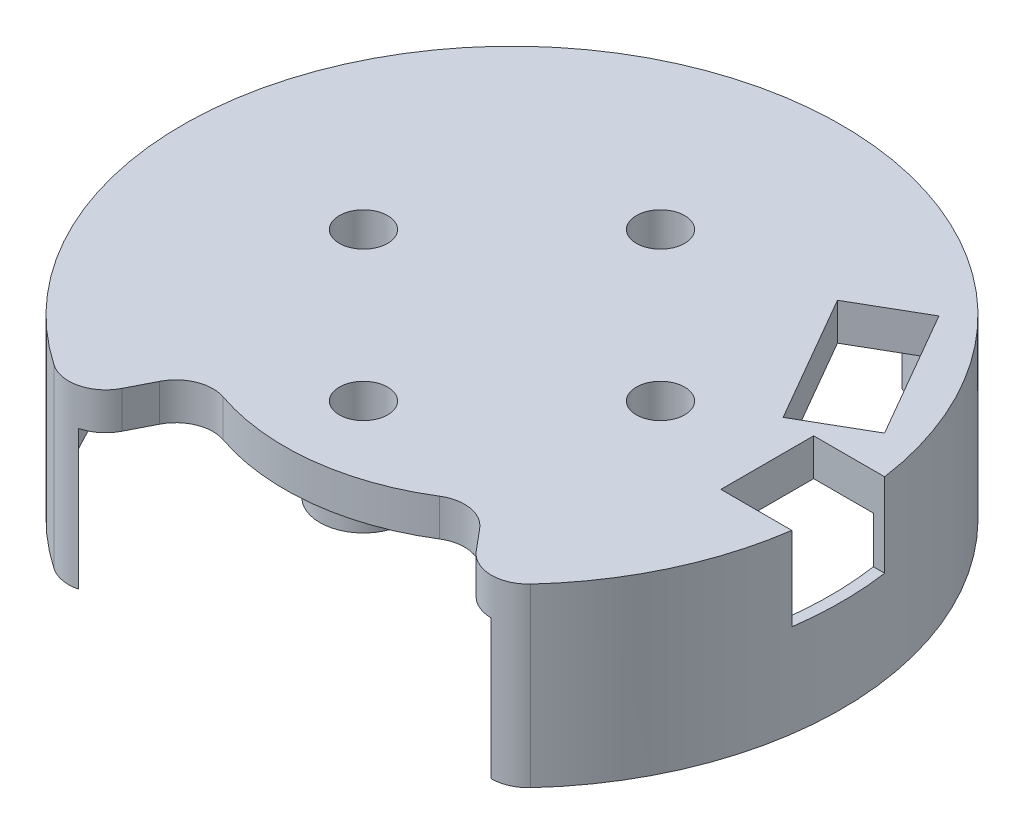
ISO-10303-21;
HEADER;
FILE_DESCRIPTION(('STEP AP214'),'2;1');
FILE_NAME('part.step','',(''),(''),'','','');
FILE_SCHEMA(('AUTOMOTIVE_DESIGN { 1 0 10303 214 1 1 1 1 }'));
ENDSEC;
DATA;
#1=APPLICATION_CONTEXT('core data for automotive mechanical design processes');
#2=APPLICATION_PROTOCOL_DEFINITION('international standard','automotive_design',2000,#1);
#3=PRODUCT_CONTEXT('',#1,'mechanical');
#4=PRODUCT('Part','Part','',(#3));
#5=PRODUCT_RELATED_PRODUCT_CATEGORY('part','',(#4));
#6=PRODUCT_DEFINITION_FORMATION('','',#4);
#7=PRODUCT_DEFINITION_CONTEXT('part definition',#1,'design');
#8=PRODUCT_DEFINITION('design','',#6,#7);
#9=PRODUCT_DEFINITION_SHAPE('','',#8);
#10=(LENGTH_UNIT() NAMED_UNIT(*) SI_UNIT(.MILLI.,.METRE.));
#11=(NAMED_UNIT(*) PLANE_ANGLE_UNIT() SI_UNIT($,.RADIAN.));
#12=(NAMED_UNIT(*) SI_UNIT($,.STERADIAN.) SOLID_ANGLE_UNIT());
#13=UNCERTAINTY_MEASURE_WITH_UNIT(LENGTH_MEASURE(1.E-05),#10,'distance_accuracy_value','');
#14=(GEOMETRIC_REPRESENTATION_CONTEXT(3) GLOBAL_UNCERTAINTY_ASSIGNED_CONTEXT((#13)) GLOBAL_UNIT_ASSIGNED_CONTEXT((#10,
#11,#12)) REPRESENTATION_CONTEXT('',''));
#15=CARTESIAN_POINT('',(0.,0.,0.));
#16=DIRECTION('',(0.,0.,1.));
#17=DIRECTION('',(1.,0.,0.));
#18=AXIS2_PLACEMENT_3D('',#15,#16,#17);
#19=CARTESIAN_POINT('',(0.,4.5,0.));
#20=DIRECTION('',(0.,-1.,0.));
#21=DIRECTION('',(0.,0.,-1.));
#22=AXIS2_PLACEMENT_3D('',#19,#20,#21);
#23=CYLINDRICAL_SURFACE('',#22,17.75);
#24=CARTESIAN_POINT('',(0.,-5.,0.));
#25=DIRECTION('',(0.,-1.,0.));
#26=DIRECTION('',(0.,0.,-1.));
#27=AXIS2_PLACEMENT_3D('',#24,#25,#26);
#28=CIRCLE('',#27,17.75);
#29=CARTESIAN_POINT('',(-10.0013975765381,-5.,14.6640562777158));
#30=VERTEX_POINT('',#29);
#31=CARTESIAN_POINT('',(-4.59403805056964,-5.,-17.145183416631));
#32=VERTEX_POINT('',#31);
#33=EDGE_CURVE('E289',#30,#32,#28,.T.);
#34=ORIENTED_EDGE('',*,*,#33,.F.);
#35=DIRECTION('',(0.,-1.,0.));
#36=VECTOR('',#35,1.);
#37=CARTESIAN_POINT('',(-10.0013975765381,4.5,14.6640562777158));
#38=LINE('',#37,#36);
#39=CARTESIAN_POINT('',(-10.0013975765381,4.5,14.6640562777158));
#40=VERTEX_POINT('',#39);
#41=EDGE_CURVE('E385',#30,#40,#38,.F.);
#42=ORIENTED_EDGE('',*,*,#41,.T.);
#43=CARTESIAN_POINT('',(0.,4.5,0.));
#44=DIRECTION('',(0.,1.,0.));
#45=DIRECTION('',(0.,0.,1.));
#46=AXIS2_PLACEMENT_3D('',#43,#44,#45);
#47=CIRCLE('',#46,17.75);
#48=CARTESIAN_POINT('',(17.57306177079,4.5,-2.5));
#49=VERTEX_POINT('',#48);
#50=EDGE_CURVE('E342',#49,#40,#47,.T.);
#51=ORIENTED_EDGE('',*,*,#50,.F.);
#52=DIRECTION('',(0.,-1.,0.));
#53=VECTOR('',#52,1.);
#54=CARTESIAN_POINT('',(17.57306177079,4.5,-2.5));
#55=LINE('',#54,#53);
#56=CARTESIAN_POINT('',(17.57306177079,0.,-2.5));
#57=VERTEX_POINT('',#56);
#58=EDGE_CURVE('E270',#49,#57,#55,.T.);
#59=ORIENTED_EDGE('',*,*,#58,.T.);
#60=CARTESIAN_POINT('',(0.,0.,0.));
#61=DIRECTION('',(0.,1.,0.));
#62=DIRECTION('',(0.,0.,1.));
#63=AXIS2_PLACEMENT_3D('',#60,#61,#62);
#64=CIRCLE('',#63,17.75);
#65=CARTESIAN_POINT('',(17.57306177079,0.,2.5));
#66=VERTEX_POINT('',#65);
#67=EDGE_CURVE('E264',#66,#57,#64,.T.);
#68=ORIENTED_EDGE('',*,*,#67,.F.);
#69=DIRECTION('',(0.,-1.,0.));
#70=VECTOR('',#69,1.);
#71=CARTESIAN_POINT('',(17.57306177079,4.5,2.5));
#72=LINE('',#71,#70);
#73=CARTESIAN_POINT('',(17.57306177079,4.5,2.5));
#74=VERTEX_POINT('',#73);
#75=EDGE_CURVE('E276',#66,#74,#72,.F.);
#76=ORIENTED_EDGE('',*,*,#75,.T.);
#77=CARTESIAN_POINT('',(13.0437573252243,4.5,12.0383925355779));
#78=VERTEX_POINT('',#77);
#79=EDGE_CURVE('E341',#78,#74,#47,.T.);
#80=ORIENTED_EDGE('',*,*,#79,.F.);
#81=DIRECTION('',(0.,-1.,0.));
#82=VECTOR('',#81,1.);
#83=CARTESIAN_POINT('',(13.0437573252243,4.5,12.0383925355779));
#84=LINE('',#83,#82);
#85=CARTESIAN_POINT('',(13.0437573252243,-5.,12.0383925355779));
#86=VERTEX_POINT('',#85);
#87=EDGE_CURVE('E383',#78,#86,#84,.T.);
#88=ORIENTED_EDGE('',*,*,#87,.T.);
#89=CARTESIAN_POINT('',(4.59403805056963,-5.,-17.145183416631));
#90=VERTEX_POINT('',#89);
#91=EDGE_CURVE('E284',#90,#86,#28,.T.);
#92=ORIENTED_EDGE('',*,*,#91,.F.);
#93=DIRECTION('',(0.,-1.,0.));
#94=VECTOR('',#93,1.);
#95=CARTESIAN_POINT('',(4.59403805056963,-1.5,-17.145183416631));
#96=LINE('',#95,#94);
#97=CARTESIAN_POINT('',(4.59403805056963,-1.5,-17.145183416631));
#98=VERTEX_POINT('',#97);
#99=EDGE_CURVE('E229',#98,#90,#96,.T.);
#100=ORIENTED_EDGE('',*,*,#99,.F.);
#101=CARTESIAN_POINT('',(0.,-1.5,0.));
#102=DIRECTION('',(0.,-1.,0.));
#103=DIRECTION('',(0.,0.,-1.));
#104=AXIS2_PLACEMENT_3D('',#101,#102,#103);
#105=CIRCLE('',#104,17.75);
#106=CARTESIAN_POINT('',(-4.59403805056964,-1.5,-17.145183416631));
#107=VERTEX_POINT('',#106);
#108=EDGE_CURVE('E860',#107,#98,#105,.T.);
#109=ORIENTED_EDGE('',*,*,#108,.F.);
#110=DIRECTION('',(0.,-1.,0.));
#111=VECTOR('',#110,1.);
#112=CARTESIAN_POINT('',(-4.59403805056964,-1.5,-17.145183416631));
#113=LINE('',#112,#111);
#114=EDGE_CURVE('E218',#107,#32,#113,.T.);
#115=ORIENTED_EDGE('',*,*,#114,.T.);
#116=EDGE_LOOP('',(#34,#42,#51,#59,#68,#76,#80,#88,#92,#100,#109,#115));
#117=FACE_BOUND('',#116,.T.);
#118=ADVANCED_FACE('F37',(#117),#23,.T.);
#119=CARTESIAN_POINT('',(0.,-5.,0.));
#120=DIRECTION('',(0.,-1.,0.));
#121=DIRECTION('',(0.,0.,-1.));
#122=AXIS2_PLACEMENT_3D('',#119,#120,#121);
#123=PLANE('',#122);
#124=CARTESIAN_POINT('',(0.,-5.,0.));
#125=DIRECTION('',(0.,-1.,0.));
#126=DIRECTION('',(0.,0.,-1.));
#127=AXIS2_PLACEMENT_3D('',#124,#125,#126);
#128=CIRCLE('',#127,17.15);
#129=CARTESIAN_POINT('',(-8.39669798990904,-5.,14.9538611357153));
#130=VERTEX_POINT('',#129);
#131=CARTESIAN_POINT('',(-4.43874662350813,-5.,-16.5656279208575));
#132=VERTEX_POINT('',#131);
#133=EDGE_CURVE('E222',#130,#132,#128,.T.);
#134=ORIENTED_EDGE('',*,*,#133,.F.);
#135=CARTESIAN_POINT('',(-8.87447953974509,-5.,13.0117682464239));
#136=DIRECTION('',(0.,-1.,0.));
#137=DIRECTION('',(0.,0.,-1.));
#138=AXIS2_PLACEMENT_3D('',#135,#136,#137);
#139=CIRCLE('',#138,2.);
#140=EDGE_CURVE('E404',#130,#30,#139,.T.);
#141=ORIENTED_EDGE('',*,*,#140,.T.);
#142=ORIENTED_EDGE('',*,*,#33,.T.);
#143=DIRECTION('',(0.258819045102517,0.,0.965925826289069));
#144=VECTOR('',#143,1.);
#145=CARTESIAN_POINT('',(-4.59403805056963,-5.,-17.145183416631));
#146=LINE('',#145,#144);
#147=EDGE_CURVE('E858',#32,#132,#146,.T.);
#148=ORIENTED_EDGE('',*,*,#147,.T.);
#149=EDGE_LOOP('',(#134,#141,#142,#148));
#150=FACE_BOUND('',#149,.T.);
#151=ADVANCED_FACE('F492',(#150),#123,.T.);
#152=ORIENTED_EDGE('',*,*,#91,.T.);
#153=CARTESIAN_POINT('',(11.5740381899878,-5.,10.6819539400198));
#154=DIRECTION('',(0.,-1.,0.));
#155=DIRECTION('',(0.,0.,-1.));
#156=AXIS2_PLACEMENT_3D('',#153,#154,#155);
#157=CIRCLE('',#156,2.);
#158=CARTESIAN_POINT('',(11.5453779934007,-5.,12.6817485777593));
#159=VERTEX_POINT('',#158);
#160=EDGE_CURVE('E52',#86,#159,#157,.T.);
#161=ORIENTED_EDGE('',*,*,#160,.T.);
#162=CARTESIAN_POINT('',(4.43874662350812,-5.,-16.5656279208575));
#163=VERTEX_POINT('',#162);
#164=EDGE_CURVE('E285',#163,#159,#128,.T.);
#165=ORIENTED_EDGE('',*,*,#164,.F.);
#166=DIRECTION('',(0.258819045102517,0.,-0.965925826289069));
#167=VECTOR('',#166,1.);
#168=CARTESIAN_POINT('',(4.43874662350812,-5.,-16.5656279208575));
#169=LINE('',#168,#167);
#170=EDGE_CURVE('E219',#163,#90,#169,.T.);
#171=ORIENTED_EDGE('',*,*,#170,.T.);
#172=EDGE_LOOP('',(#152,#161,#165,#171));
#173=FACE_BOUND('',#172,.T.);
#174=ADVANCED_FACE('F497',(#173),#123,.T.);
#175=CARTESIAN_POINT('',(0.,-5.,0.));
#176=DIRECTION('',(0.,1.,0.));
#177=DIRECTION('',(0.,0.,1.));
#178=AXIS2_PLACEMENT_3D('',#175,#176,#177);
#179=CYLINDRICAL_SURFACE('',#178,17.15);
#180=CARTESIAN_POINT('',(0.,2.5,0.));
#181=DIRECTION('',(0.,-1.,0.));
#182=DIRECTION('',(0.,0.,-1.));
#183=AXIS2_PLACEMENT_3D('',#180,#181,#182);
#184=CIRCLE('',#183,17.15);
#185=CARTESIAN_POINT('',(-8.39669798990904,2.5,14.9538611357153));
#186=VERTEX_POINT('',#185);
#187=CARTESIAN_POINT('',(16.966805827851,2.5,-2.5));
#188=VERTEX_POINT('',#187);
#189=EDGE_CURVE('E282',#186,#188,#184,.T.);
#190=ORIENTED_EDGE('',*,*,#189,.F.);
#191=DIRECTION('',(0.,-1.,0.));
#192=VECTOR('',#191,1.);
#193=CARTESIAN_POINT('',(-8.39669798990904,2.5,14.9538611357153));
#194=LINE('',#193,#192);
#195=EDGE_CURVE('E60',#186,#130,#194,.T.);
#196=ORIENTED_EDGE('',*,*,#195,.T.);
#197=ORIENTED_EDGE('',*,*,#133,.T.);
#198=DIRECTION('',(0.,-1.,0.));
#199=VECTOR('',#198,1.);
#200=CARTESIAN_POINT('',(-4.43874662350813,-1.5,-16.5656279208575));
#201=LINE('',#200,#199);
#202=CARTESIAN_POINT('',(-4.43874662350813,-1.5,-16.5656279208575));
#203=VERTEX_POINT('',#202);
#204=EDGE_CURVE('E215',#203,#132,#201,.T.);
#205=ORIENTED_EDGE('',*,*,#204,.F.);
#206=CARTESIAN_POINT('',(0.,-1.5,0.));
#207=DIRECTION('',(0.,-1.,0.));
#208=DIRECTION('',(0.,0.,-1.));
#209=AXIS2_PLACEMENT_3D('',#206,#207,#208);
#210=CIRCLE('',#209,17.15);
#211=CARTESIAN_POINT('',(4.43874662350812,-1.5,-16.5656279208575));
#212=VERTEX_POINT('',#211);
#213=EDGE_CURVE('E200',#203,#212,#210,.T.);
#214=ORIENTED_EDGE('',*,*,#213,.T.);
#215=DIRECTION('',(0.,-1.,0.));
#216=VECTOR('',#215,1.);
#217=CARTESIAN_POINT('',(4.43874662350812,-1.5,-16.5656279208575));
#218=LINE('',#217,#216);
#219=EDGE_CURVE('E224',#212,#163,#218,.T.);
#220=ORIENTED_EDGE('',*,*,#219,.T.);
#221=ORIENTED_EDGE('',*,*,#164,.T.);
#222=DIRECTION('',(0.,-1.,0.));
#223=VECTOR('',#222,1.);
#224=CARTESIAN_POINT('',(11.5453779934007,-5.,12.6817485777593));
#225=LINE('',#224,#223);
#226=CARTESIAN_POINT('',(11.5453779934006,2.5,12.6817485777593));
#227=VERTEX_POINT('',#226);
#228=EDGE_CURVE('E401',#159,#227,#225,.F.);
#229=ORIENTED_EDGE('',*,*,#228,.T.);
#230=CARTESIAN_POINT('',(16.966805827851,2.5,2.5));
#231=VERTEX_POINT('',#230);
#232=EDGE_CURVE('E286',#231,#227,#184,.T.);
#233=ORIENTED_EDGE('',*,*,#232,.F.);
#234=DIRECTION('',(0.,1.,0.));
#235=VECTOR('',#234,1.);
#236=CARTESIAN_POINT('',(16.966805827851,-5.,2.5));
#237=LINE('',#236,#235);
#238=CARTESIAN_POINT('',(16.966805827851,0.,2.5));
#239=VERTEX_POINT('',#238);
#240=EDGE_CURVE('E381',#239,#231,#237,.T.);
#241=ORIENTED_EDGE('',*,*,#240,.F.);
#242=CARTESIAN_POINT('',(0.,0.,0.));
#243=DIRECTION('',(0.,1.,0.));
#244=DIRECTION('',(0.,0.,1.));
#245=AXIS2_PLACEMENT_3D('',#242,#243,#244);
#246=CIRCLE('',#245,17.15);
#247=CARTESIAN_POINT('',(16.966805827851,0.,-2.5));
#248=VERTEX_POINT('',#247);
#249=EDGE_CURVE('E375',#239,#248,#246,.T.);
#250=ORIENTED_EDGE('',*,*,#249,.T.);
#251=DIRECTION('',(0.,1.,0.));
#252=VECTOR('',#251,1.);
#253=CARTESIAN_POINT('',(16.966805827851,-5.,-2.5));
#254=LINE('',#253,#252);
#255=EDGE_CURVE('E378',#188,#248,#254,.F.);
#256=ORIENTED_EDGE('',*,*,#255,.F.);
#257=EDGE_LOOP('',(#190,#196,#197,#205,#214,#220,#221,#229,#233,#241,#250,#256));
#258=FACE_BOUND('',#257,.T.);
#259=ADVANCED_FACE('F221',(#258),#179,.F.);
#260=CARTESIAN_POINT('',(0.,2.5,0.));
#261=DIRECTION('',(0.,1.,0.));
#262=DIRECTION('',(0.,0.,1.));
#263=AXIS2_PLACEMENT_3D('',#260,#261,#262);
#264=PLANE('',#263);
#265=CARTESIAN_POINT('',(0.,2.5,-8.));
#266=DIRECTION('',(0.,1.,0.));
#267=DIRECTION('',(0.,0.,1.));
#268=AXIS2_PLACEMENT_3D('',#265,#266,#267);
#269=CIRCLE('',#268,2.35);
#270=CARTESIAN_POINT('',(0.,2.5,-5.65));
#271=VERTEX_POINT('',#270);
#272=EDGE_CURVE('E349',#271,#271,#269,.T.);
#273=ORIENTED_EDGE('',*,*,#272,.T.);
#274=EDGE_LOOP('',(#273));
#275=FACE_BOUND('',#274,.T.);
#276=CARTESIAN_POINT('',(8.,2.5,0.));
#277=DIRECTION('',(0.,1.,0.));
#278=DIRECTION('',(0.,0.,1.));
#279=AXIS2_PLACEMENT_3D('',#276,#277,#278);
#280=CIRCLE('',#279,2.35);
#281=CARTESIAN_POINT('',(8.,2.5,2.35));
#282=VERTEX_POINT('',#281);
#283=EDGE_CURVE('E352',#282,#282,#280,.F.);
#284=ORIENTED_EDGE('',*,*,#283,.F.);
#285=EDGE_LOOP('',(#284));
#286=FACE_BOUND('',#285,.T.);
#287=CARTESIAN_POINT('',(0.,2.5,8.));
#288=DIRECTION('',(0.,1.,0.));
#289=DIRECTION('',(0.,0.,1.));
#290=AXIS2_PLACEMENT_3D('',#287,#288,#289);
#291=CIRCLE('',#290,2.35);
#292=CARTESIAN_POINT('',(0.,2.5,10.35));
#293=VERTEX_POINT('',#292);
#294=EDGE_CURVE('E357',#293,#293,#291,.F.);
#295=ORIENTED_EDGE('',*,*,#294,.F.);
#296=EDGE_LOOP('',(#295));
#297=FACE_BOUND('',#296,.T.);
#298=CARTESIAN_POINT('',(-8.,2.5,0.));
#299=DIRECTION('',(0.,1.,0.));
#300=DIRECTION('',(0.,0.,1.));
#301=AXIS2_PLACEMENT_3D('',#298,#299,#300);
#302=CIRCLE('',#301,2.35);
#303=CARTESIAN_POINT('',(-8.,2.5,2.35));
#304=VERTEX_POINT('',#303);
#305=EDGE_CURVE('E360',#304,#304,#302,.F.);
#306=ORIENTED_EDGE('',*,*,#305,.F.);
#307=EDGE_LOOP('',(#306));
#308=FACE_BOUND('',#307,.T.);
#309=DIRECTION('',(-0.500000051434071,0.,-0.866025374088962));
#310=VECTOR('',#309,1.);
#311=CARTESIAN_POINT('',(13.6131392623697,2.5,-7.85955069564142));
#312=LINE('',#311,#310);
#313=CARTESIAN_POINT('',(15.5320509539142,2.5,-4.53589860651229));
#314=VERTEX_POINT('',#313);
#315=CARTESIAN_POINT('',(11.5320505424416,2.5,-11.464101599224));
#316=VERTEX_POINT('',#315);
#317=EDGE_CURVE('E369',#314,#316,#312,.T.);
#318=ORIENTED_EDGE('',*,*,#317,.T.);
#319=DIRECTION('',(-0.866025374088962,0.,0.500000051434071));
#320=VECTOR('',#319,1.);
#321=CARTESIAN_POINT('',(-2.08108871992805,2.5,-3.60455090358257));
#322=LINE('',#321,#320);
#323=CARTESIAN_POINT('',(8.0679490460858,2.5,-9.4641013934877));
#324=VERTEX_POINT('',#323);
#325=EDGE_CURVE('E372',#316,#324,#322,.T.);
#326=ORIENTED_EDGE('',*,*,#325,.T.);
#327=DIRECTION('',(0.500000051434071,0.,0.866025374088962));
#328=VECTOR('',#327,1.);
#329=CARTESIAN_POINT('',(10.1490377660138,2.5,-5.85955048990513));
#330=LINE('',#329,#328);
#331=CARTESIAN_POINT('',(12.0679494575584,2.5,-2.53589840077601));
#332=VERTEX_POINT('',#331);
#333=EDGE_CURVE('E363',#324,#332,#330,.T.);
#334=ORIENTED_EDGE('',*,*,#333,.T.);
#335=DIRECTION('',(0.866025374088962,0.,-0.500000051434071));
#336=VECTOR('',#335,1.);
#337=CARTESIAN_POINT('',(1.91891169154451,2.5,3.32365208912912));
#338=LINE('',#337,#336);
#339=EDGE_CURVE('E366',#332,#314,#338,.T.);
#340=ORIENTED_EDGE('',*,*,#339,.T.);
#341=EDGE_LOOP('',(#318,#326,#334,#340));
#342=FACE_BOUND('',#341,.T.);
#343=DIRECTION('',(-0.453990499739541,0.,0.891006524188371));
#344=VECTOR('',#343,1.);
#345=CARTESIAN_POINT('',(0.,2.5,0.));
#346=LINE('',#345,#344);
#347=CARTESIAN_POINT('',(-6.40532974231333,2.5,12.571167443489));
#348=VERTEX_POINT('',#347);
#349=CARTESIAN_POINT('',(-7.09246649136834,2.5,13.919749245903));
#350=VERTEX_POINT('',#349);
#351=EDGE_CURVE('E241',#348,#350,#346,.T.);
#352=ORIENTED_EDGE('',*,*,#351,.T.);
#353=CARTESIAN_POINT('',(-8.87447953974509,2.5,13.0117682464239));
#354=DIRECTION('',(0.,1.,0.));
#355=DIRECTION('',(0.,0.,1.));
#356=AXIS2_PLACEMENT_3D('',#353,#354,#355);
#357=CIRCLE('',#356,2.);
#358=EDGE_CURVE('E399',#350,#186,#357,.F.);
#359=ORIENTED_EDGE('',*,*,#358,.T.);
#360=ORIENTED_EDGE('',*,*,#189,.T.);
#361=DIRECTION('',(-1.,0.,0.));
#362=VECTOR('',#361,1.);
#363=CARTESIAN_POINT('',(0.,2.5,-2.5));
#364=LINE('',#363,#362);
#365=CARTESIAN_POINT('',(13.75,2.5,-2.5));
#366=VERTEX_POINT('',#365);
#367=EDGE_CURVE('E267',#188,#366,#364,.T.);
#368=ORIENTED_EDGE('',*,*,#367,.T.);
#369=DIRECTION('',(0.,0.,1.));
#370=VECTOR('',#369,1.);
#371=CARTESIAN_POINT('',(13.75,2.5,0.));
#372=LINE('',#371,#370);
#373=CARTESIAN_POINT('',(13.75,2.5,2.5));
#374=VERTEX_POINT('',#373);
#375=EDGE_CURVE('E279',#366,#374,#372,.T.);
#376=ORIENTED_EDGE('',*,*,#375,.T.);
#377=DIRECTION('',(1.,0.,0.));
#378=VECTOR('',#377,1.);
#379=CARTESIAN_POINT('',(0.,2.5,2.5));
#380=LINE('',#379,#378);
#381=EDGE_CURVE('E273',#374,#231,#380,.T.);
#382=ORIENTED_EDGE('',*,*,#381,.T.);
#383=ORIENTED_EDGE('',*,*,#232,.T.);
#384=CARTESIAN_POINT('',(11.5740381899878,2.5,10.6819539400198));
#385=DIRECTION('',(0.,1.,0.));
#386=DIRECTION('',(0.,0.,1.));
#387=AXIS2_PLACEMENT_3D('',#384,#385,#386);
#388=CIRCLE('',#387,2.);
#389=CARTESIAN_POINT('',(10.0419493037498,2.5,11.9675291593929));
#390=VERTEX_POINT('',#389);
#391=EDGE_CURVE('E397',#227,#390,#388,.F.);
#392=ORIENTED_EDGE('',*,*,#391,.T.);
#393=DIRECTION('',(-0.642787609686536,0.,-0.766044443118981));
#394=VECTOR('',#393,1.);
#395=CARTESIAN_POINT('',(0.,2.5,0.));
#396=LINE('',#395,#394);
#397=CARTESIAN_POINT('',(9.06905892673476,2.5,10.8080835573848));
#398=VERTEX_POINT('',#397);
#399=EDGE_CURVE('E238',#390,#398,#396,.T.);
#400=ORIENTED_EDGE('',*,*,#399,.T.);
#401=CARTESIAN_POINT('',(7.53697004049679,2.5,12.0936587767579));
#402=DIRECTION('',(0.,1.,0.));
#403=DIRECTION('',(0.,0.,1.));
#404=AXIS2_PLACEMENT_3D('',#401,#402,#403);
#405=CIRCLE('',#404,2.);
#406=CARTESIAN_POINT('',(6.47914968393584,2.5,10.3963031589673));
#407=VERTEX_POINT('',#406);
#408=EDGE_CURVE('E11',#398,#407,#405,.T.);
#409=ORIENTED_EDGE('',*,*,#408,.T.);
#410=CARTESIAN_POINT('',(0.,2.5,0.));
#411=DIRECTION('',(0.,1.,0.));
#412=DIRECTION('',(0.,0.,1.));
#413=AXIS2_PLACEMENT_3D('',#410,#411,#412);
#414=CIRCLE('',#413,12.25);
#415=CARTESIAN_POINT('',(-3.97443014040163,2.5,11.587338135183));
#416=VERTEX_POINT('',#415);
#417=EDGE_CURVE('E244',#407,#416,#414,.F.);
#418=ORIENTED_EDGE('',*,*,#417,.T.);
#419=CARTESIAN_POINT('',(-4.62331669393659,2.5,13.479148442968));
#420=DIRECTION('',(0.,1.,0.));
#421=DIRECTION('',(0.,0.,1.));
#422=AXIS2_PLACEMENT_3D('',#419,#420,#421);
#423=CIRCLE('',#422,2.);
#424=EDGE_CURVE('E419',#416,#348,#423,.T.);
#425=ORIENTED_EDGE('',*,*,#424,.T.);
#426=EDGE_LOOP('',(#352,#359,#360,#368,#376,#382,#383,#392,#400,#409,#418,#425));
#427=FACE_BOUND('',#426,.T.);
#428=ADVANCED_FACE('F435',(#275,#286,#297,#308,#342,#427),#264,.F.);
#429=CARTESIAN_POINT('',(0.,0.,-8.));
#430=DIRECTION('',(0.,1.,0.));
#431=DIRECTION('',(0.,0.,1.));
#432=AXIS2_PLACEMENT_3D('',#429,#430,#431);
#433=PLANE('',#432);
#434=CARTESIAN_POINT('',(0.,0.,-8.));
#435=DIRECTION('',(0.,1.,0.));
#436=DIRECTION('',(0.,0.,1.));
#437=AXIS2_PLACEMENT_3D('',#434,#435,#436);
#438=CIRCLE('',#437,2.35);
#439=CARTESIAN_POINT('',(0.,0.,-5.65));
#440=VERTEX_POINT('',#439);
#441=EDGE_CURVE('E348',#440,#440,#438,.T.);
#442=ORIENTED_EDGE('',*,*,#441,.F.);
#443=EDGE_LOOP('',(#442));
#444=FACE_BOUND('',#443,.T.);
#445=CARTESIAN_POINT('',(0.,0.,-8.));
#446=DIRECTION('',(0.,1.,0.));
#447=DIRECTION('',(0.,0.,1.));
#448=AXIS2_PLACEMENT_3D('',#445,#446,#447);
#449=CIRCLE('',#448,1.3);
#450=CARTESIAN_POINT('',(0.,0.,-6.7));
#451=VERTEX_POINT('',#450);
#452=EDGE_CURVE('E345',#451,#451,#449,.T.);
#453=ORIENTED_EDGE('',*,*,#452,.T.);
#454=EDGE_LOOP('',(#453));
#455=FACE_BOUND('',#454,.T.);
#456=ADVANCED_FACE('F508',(#444,#455),#433,.F.);
#457=CARTESIAN_POINT('',(0.,2.5,-8.));
#458=DIRECTION('',(0.,-1.,0.));
#459=DIRECTION('',(0.,0.,-1.));
#460=AXIS2_PLACEMENT_3D('',#457,#458,#459);
#461=CYLINDRICAL_SURFACE('',#460,2.35);
#462=ORIENTED_EDGE('',*,*,#272,.F.);
#463=EDGE_LOOP('',(#462));
#464=FACE_BOUND('',#463,.T.);
#465=ORIENTED_EDGE('',*,*,#441,.T.);
#466=EDGE_LOOP('',(#465));
#467=FACE_BOUND('',#466,.T.);
#468=ADVANCED_FACE('F506',(#464,#467),#461,.T.);
#469=CARTESIAN_POINT('',(0.,2.5,-8.));
#470=DIRECTION('',(0.,-1.,0.));
#471=DIRECTION('',(0.,0.,-1.));
#472=AXIS2_PLACEMENT_3D('',#469,#470,#471);
#473=CYLINDRICAL_SURFACE('',#472,1.3);
#474=ORIENTED_EDGE('',*,*,#452,.F.);
#475=EDGE_LOOP('',(#474));
#476=FACE_BOUND('',#475,.T.);
#477=CARTESIAN_POINT('',(0.,4.5,-8.));
#478=DIRECTION('',(0.,-1.,0.));
#479=DIRECTION('',(0.,0.,-1.));
#480=AXIS2_PLACEMENT_3D('',#477,#478,#479);
#481=CIRCLE('',#480,1.3);
#482=CARTESIAN_POINT('',(0.,4.5,-9.3));
#483=VERTEX_POINT('',#482);
#484=EDGE_CURVE('E312',#483,#483,#481,.T.);
#485=ORIENTED_EDGE('',*,*,#484,.F.);
#486=EDGE_LOOP('',(#485));
#487=FACE_BOUND('',#486,.T.);
#488=ADVANCED_FACE('F503',(#476,#487),#473,.F.);
#489=CARTESIAN_POINT('',(0.,4.5,0.));
#490=DIRECTION('',(0.,1.,0.));
#491=DIRECTION('',(0.,0.,1.));
#492=AXIS2_PLACEMENT_3D('',#489,#490,#491);
#493=PLANE('',#492);
#494=ORIENTED_EDGE('',*,*,#50,.T.);
#495=CARTESIAN_POINT('',(-8.87447953974509,4.5,13.0117682464239));
#496=DIRECTION('',(0.,1.,0.));
#497=DIRECTION('',(0.,0.,1.));
#498=AXIS2_PLACEMENT_3D('',#495,#496,#497);
#499=CIRCLE('',#498,2.);
#500=CARTESIAN_POINT('',(-7.09246649136835,4.5,13.919749245903));
#501=VERTEX_POINT('',#500);
#502=EDGE_CURVE('E390',#40,#501,#499,.T.);
#503=ORIENTED_EDGE('',*,*,#502,.T.);
#504=DIRECTION('',(-0.453990499739541,0.,0.891006524188371));
#505=VECTOR('',#504,1.);
#506=CARTESIAN_POINT('',(-8.05833137037685,4.5,15.8153658043436));
#507=LINE('',#506,#505);
#508=CARTESIAN_POINT('',(-6.40532974231333,4.5,12.5711674434889));
#509=VERTEX_POINT('',#508);
#510=EDGE_CURVE('E235',#509,#501,#507,.T.);
#511=ORIENTED_EDGE('',*,*,#510,.F.);
#512=CARTESIAN_POINT('',(-4.62331669393659,4.5,13.479148442968));
#513=DIRECTION('',(0.,1.,0.));
#514=DIRECTION('',(0.,0.,1.));
#515=AXIS2_PLACEMENT_3D('',#512,#513,#514);
#516=CIRCLE('',#515,2.);
#517=CARTESIAN_POINT('',(-3.97443014040163,4.5,11.587338135183));
#518=VERTEX_POINT('',#517);
#519=EDGE_CURVE('E417',#509,#518,#516,.F.);
#520=ORIENTED_EDGE('',*,*,#519,.T.);
#521=CARTESIAN_POINT('',(0.,4.5,0.));
#522=DIRECTION('',(0.,-1.,0.));
#523=DIRECTION('',(0.,0.,1.));
#524=AXIS2_PLACEMENT_3D('',#521,#522,#523);
#525=CIRCLE('',#524,12.25);
#526=CARTESIAN_POINT('',(6.47914968393584,4.5,10.3963031589673));
#527=VERTEX_POINT('',#526);
#528=EDGE_CURVE('E227',#527,#518,#525,.T.);
#529=ORIENTED_EDGE('',*,*,#528,.F.);
#530=CARTESIAN_POINT('',(7.53697004049679,4.5,12.0936587767579));
#531=DIRECTION('',(0.,1.,0.));
#532=DIRECTION('',(0.,0.,1.));
#533=AXIS2_PLACEMENT_3D('',#530,#531,#532);
#534=CIRCLE('',#533,2.);
#535=CARTESIAN_POINT('',(9.06905892673475,4.5,10.8080835573848));
#536=VERTEX_POINT('',#535);
#537=EDGE_CURVE('E45',#527,#536,#534,.F.);
#538=ORIENTED_EDGE('',*,*,#537,.T.);
#539=DIRECTION('',(-0.642787609686536,0.,-0.766044443118981));
#540=VECTOR('',#539,1.);
#541=CARTESIAN_POINT('',(11.409480071936,4.5,13.5972888653619));
#542=LINE('',#541,#540);
#543=CARTESIAN_POINT('',(10.0419493037498,4.5,11.9675291593929));
#544=VERTEX_POINT('',#543);
#545=EDGE_CURVE('E223',#544,#536,#542,.T.);
#546=ORIENTED_EDGE('',*,*,#545,.F.);
#547=CARTESIAN_POINT('',(11.5740381899878,4.5,10.6819539400198));
#548=DIRECTION('',(0.,1.,0.));
#549=DIRECTION('',(0.,0.,1.));
#550=AXIS2_PLACEMENT_3D('',#547,#548,#549);
#551=CIRCLE('',#550,2.);
#552=EDGE_CURVE('E388',#544,#78,#551,.T.);
#553=ORIENTED_EDGE('',*,*,#552,.T.);
#554=ORIENTED_EDGE('',*,*,#79,.T.);
#555=DIRECTION('',(1.,0.,0.));
#556=VECTOR('',#555,1.);
#557=CARTESIAN_POINT('',(13.75,4.5,2.5));
#558=LINE('',#557,#556);
#559=CARTESIAN_POINT('',(13.75,4.5,2.5));
#560=VERTEX_POINT('',#559);
#561=EDGE_CURVE('E251',#560,#74,#558,.T.);
#562=ORIENTED_EDGE('',*,*,#561,.F.);
#563=DIRECTION('',(0.,0.,1.));
#564=VECTOR('',#563,1.);
#565=CARTESIAN_POINT('',(13.75,4.5,-2.5));
#566=LINE('',#565,#564);
#567=CARTESIAN_POINT('',(13.75,4.5,-2.5));
#568=VERTEX_POINT('',#567);
#569=EDGE_CURVE('E257',#568,#560,#566,.T.);
#570=ORIENTED_EDGE('',*,*,#569,.F.);
#571=DIRECTION('',(-1.,0.,0.));
#572=VECTOR('',#571,1.);
#573=CARTESIAN_POINT('',(13.75,4.5,-2.5));
#574=LINE('',#573,#572);
#575=EDGE_CURVE('E247',#49,#568,#574,.T.);
#576=ORIENTED_EDGE('',*,*,#575,.F.);
#577=EDGE_LOOP('',(#494,#503,#511,#520,#529,#538,#546,#553,#554,#562,#570,#576));
#578=FACE_BOUND('',#577,.T.);
#579=DIRECTION('',(-0.866025374088962,0.,0.500000051434071));
#580=VECTOR('',#579,1.);
#581=CARTESIAN_POINT('',(-2.08108871992805,4.5,-3.60455090358257));
#582=LINE('',#581,#580);
#583=CARTESIAN_POINT('',(11.5320505424416,4.5,-11.464101599224));
#584=VERTEX_POINT('',#583);
#585=CARTESIAN_POINT('',(8.06794904608579,4.5,-9.4641013934877));
#586=VERTEX_POINT('',#585);
#587=EDGE_CURVE('E308',#584,#586,#582,.T.);
#588=ORIENTED_EDGE('',*,*,#587,.F.);
#589=DIRECTION('',(-0.500000051434071,0.,-0.866025374088962));
#590=VECTOR('',#589,1.);
#591=CARTESIAN_POINT('',(13.6131392623697,4.5,-7.85955069564142));
#592=LINE('',#591,#590);
#593=CARTESIAN_POINT('',(15.5320509539142,4.5,-4.53589860651229));
#594=VERTEX_POINT('',#593);
#595=EDGE_CURVE('E306',#594,#584,#592,.T.);
#596=ORIENTED_EDGE('',*,*,#595,.F.);
#597=DIRECTION('',(0.866025374088962,0.,-0.500000051434071));
#598=VECTOR('',#597,1.);
#599=CARTESIAN_POINT('',(1.91891169154451,4.5,3.32365208912912));
#600=LINE('',#599,#598);
#601=CARTESIAN_POINT('',(12.0679494575584,4.5,-2.53589840077601));
#602=VERTEX_POINT('',#601);
#603=EDGE_CURVE('E304',#602,#594,#600,.T.);
#604=ORIENTED_EDGE('',*,*,#603,.F.);
#605=DIRECTION('',(0.500000051434071,0.,0.866025374088962));
#606=VECTOR('',#605,1.);
#607=CARTESIAN_POINT('',(10.1490377660138,4.5,-5.85955048990513));
#608=LINE('',#607,#606);
#609=EDGE_CURVE('E295',#586,#602,#608,.T.);
#610=ORIENTED_EDGE('',*,*,#609,.F.);
#611=EDGE_LOOP('',(#588,#596,#604,#610));
#612=FACE_BOUND('',#611,.T.);
#613=ORIENTED_EDGE('',*,*,#484,.T.);
#614=EDGE_LOOP('',(#613));
#615=FACE_BOUND('',#614,.T.);
#616=CARTESIAN_POINT('',(8.,4.5,0.));
#617=DIRECTION('',(0.,-1.,0.));
#618=DIRECTION('',(0.,0.,-1.));
#619=AXIS2_PLACEMENT_3D('',#616,#617,#618);
#620=CIRCLE('',#619,1.3);
#621=CARTESIAN_POINT('',(8.,4.5,-1.3));
#622=VERTEX_POINT('',#621);
#623=EDGE_CURVE('E316',#622,#622,#620,.T.);
#624=ORIENTED_EDGE('',*,*,#623,.T.);
#625=EDGE_LOOP('',(#624));
#626=FACE_BOUND('',#625,.T.);
#627=CARTESIAN_POINT('',(0.,4.5,8.));
#628=DIRECTION('',(0.,-1.,0.));
#629=DIRECTION('',(0.,0.,-1.));
#630=AXIS2_PLACEMENT_3D('',#627,#628,#629);
#631=CIRCLE('',#630,1.3);
#632=CARTESIAN_POINT('',(0.,4.5,6.7));
#633=VERTEX_POINT('',#632);
#634=EDGE_CURVE('E319',#633,#633,#631,.T.);
#635=ORIENTED_EDGE('',*,*,#634,.T.);
#636=EDGE_LOOP('',(#635));
#637=FACE_BOUND('',#636,.T.);
#638=CARTESIAN_POINT('',(-8.,4.5,0.));
#639=DIRECTION('',(0.,-1.,0.));
#640=DIRECTION('',(0.,0.,-1.));
#641=AXIS2_PLACEMENT_3D('',#638,#639,#640);
#642=CIRCLE('',#641,1.3);
#643=CARTESIAN_POINT('',(-8.,4.5,-1.3));
#644=VERTEX_POINT('',#643);
#645=EDGE_CURVE('E311',#644,#644,#642,.T.);
#646=ORIENTED_EDGE('',*,*,#645,.T.);
#647=EDGE_LOOP('',(#646));
#648=FACE_BOUND('',#647,.T.);
#649=ADVANCED_FACE('F423',(#578,#612,#615,#626,#637,#648),#493,.T.);
#650=CARTESIAN_POINT('',(8.,0.,0.));
#651=DIRECTION('',(0.,1.,0.));
#652=DIRECTION('',(0.,0.,1.));
#653=AXIS2_PLACEMENT_3D('',#650,#651,#652);
#654=PLANE('',#653);
#655=CARTESIAN_POINT('',(8.,0.,0.));
#656=DIRECTION('',(0.,1.,0.));
#657=DIRECTION('',(0.,0.,1.));
#658=AXIS2_PLACEMENT_3D('',#655,#656,#657);
#659=CIRCLE('',#658,2.35);
#660=CARTESIAN_POINT('',(8.,0.,2.35));
#661=VERTEX_POINT('',#660);
#662=EDGE_CURVE('E338',#661,#661,#659,.T.);
#663=ORIENTED_EDGE('',*,*,#662,.F.);
#664=EDGE_LOOP('',(#663));
#665=FACE_BOUND('',#664,.T.);
#666=CARTESIAN_POINT('',(8.,0.,0.));
#667=DIRECTION('',(0.,1.,0.));
#668=DIRECTION('',(0.,0.,1.));
#669=AXIS2_PLACEMENT_3D('',#666,#667,#668);
#670=CIRCLE('',#669,1.3);
#671=CARTESIAN_POINT('',(8.,0.,1.3));
#672=VERTEX_POINT('',#671);
#673=EDGE_CURVE('E335',#672,#672,#670,.T.);
#674=ORIENTED_EDGE('',*,*,#673,.T.);
#675=EDGE_LOOP('',(#674));
#676=FACE_BOUND('',#675,.T.);
#677=ADVANCED_FACE('F575',(#665,#676),#654,.F.);
#678=CARTESIAN_POINT('',(8.,2.5,0.));
#679=DIRECTION('',(0.,-1.,0.));
#680=DIRECTION('',(0.,0.,-1.));
#681=AXIS2_PLACEMENT_3D('',#678,#679,#680);
#682=CYLINDRICAL_SURFACE('',#681,2.35);
#683=ORIENTED_EDGE('',*,*,#283,.T.);
#684=EDGE_LOOP('',(#683));
#685=FACE_BOUND('',#684,.T.);
#686=ORIENTED_EDGE('',*,*,#662,.T.);
#687=EDGE_LOOP('',(#686));
#688=FACE_BOUND('',#687,.T.);
#689=ADVANCED_FACE('F735',(#685,#688),#682,.T.);
#690=CARTESIAN_POINT('',(8.,2.5,0.));
#691=DIRECTION('',(0.,-1.,0.));
#692=DIRECTION('',(0.,0.,-1.));
#693=AXIS2_PLACEMENT_3D('',#690,#691,#692);
#694=CYLINDRICAL_SURFACE('',#693,1.3);
#695=ORIENTED_EDGE('',*,*,#673,.F.);
#696=EDGE_LOOP('',(#695));
#697=FACE_BOUND('',#696,.T.);
#698=ORIENTED_EDGE('',*,*,#623,.F.);
#699=EDGE_LOOP('',(#698));
#700=FACE_BOUND('',#699,.T.);
#701=ADVANCED_FACE('F730',(#697,#700),#694,.F.);
#702=CARTESIAN_POINT('',(0.,0.,8.));
#703=DIRECTION('',(0.,1.,0.));
#704=DIRECTION('',(0.,0.,1.));
#705=AXIS2_PLACEMENT_3D('',#702,#703,#704);
#706=PLANE('',#705);
#707=CARTESIAN_POINT('',(0.,0.,8.));
#708=DIRECTION('',(0.,1.,0.));
#709=DIRECTION('',(0.,0.,1.));
#710=AXIS2_PLACEMENT_3D('',#707,#708,#709);
#711=CIRCLE('',#710,2.35);
#712=CARTESIAN_POINT('',(0.,0.,10.35));
#713=VERTEX_POINT('',#712);
#714=EDGE_CURVE('E332',#713,#713,#711,.T.);
#715=ORIENTED_EDGE('',*,*,#714,.F.);
#716=EDGE_LOOP('',(#715));
#717=FACE_BOUND('',#716,.T.);
#718=CARTESIAN_POINT('',(0.,0.,8.));
#719=DIRECTION('',(0.,1.,0.));
#720=DIRECTION('',(0.,0.,1.));
#721=AXIS2_PLACEMENT_3D('',#718,#719,#720);
#722=CIRCLE('',#721,1.3);
#723=CARTESIAN_POINT('',(0.,0.,9.3));
#724=VERTEX_POINT('',#723);
#725=EDGE_CURVE('E329',#724,#724,#722,.T.);
#726=ORIENTED_EDGE('',*,*,#725,.T.);
#727=EDGE_LOOP('',(#726));
#728=FACE_BOUND('',#727,.T.);
#729=ADVANCED_FACE('F734',(#717,#728),#706,.F.);
#730=CARTESIAN_POINT('',(0.,2.5,8.));
#731=DIRECTION('',(0.,-1.,0.));
#732=DIRECTION('',(0.,0.,-1.));
#733=AXIS2_PLACEMENT_3D('',#730,#731,#732);
#734=CYLINDRICAL_SURFACE('',#733,2.35);
#735=ORIENTED_EDGE('',*,*,#294,.T.);
#736=EDGE_LOOP('',(#735));
#737=FACE_BOUND('',#736,.T.);
#738=ORIENTED_EDGE('',*,*,#714,.T.);
#739=EDGE_LOOP('',(#738));
#740=FACE_BOUND('',#739,.T.);
#741=ADVANCED_FACE('F720',(#737,#740),#734,.T.);
#742=CARTESIAN_POINT('',(0.,2.5,8.));
#743=DIRECTION('',(0.,-1.,0.));
#744=DIRECTION('',(0.,0.,-1.));
#745=AXIS2_PLACEMENT_3D('',#742,#743,#744);
#746=CYLINDRICAL_SURFACE('',#745,1.3);
#747=ORIENTED_EDGE('',*,*,#725,.F.);
#748=EDGE_LOOP('',(#747));
#749=FACE_BOUND('',#748,.T.);
#750=ORIENTED_EDGE('',*,*,#634,.F.);
#751=EDGE_LOOP('',(#750));
#752=FACE_BOUND('',#751,.T.);
#753=ADVANCED_FACE('F715',(#749,#752),#746,.F.);
#754=CARTESIAN_POINT('',(-8.,0.,0.));
#755=DIRECTION('',(0.,1.,0.));
#756=DIRECTION('',(0.,0.,1.));
#757=AXIS2_PLACEMENT_3D('',#754,#755,#756);
#758=PLANE('',#757);
#759=CARTESIAN_POINT('',(-8.,0.,0.));
#760=DIRECTION('',(0.,1.,0.));
#761=DIRECTION('',(0.,0.,1.));
#762=AXIS2_PLACEMENT_3D('',#759,#760,#761);
#763=CIRCLE('',#762,2.35);
#764=CARTESIAN_POINT('',(-8.,0.,2.35));
#765=VERTEX_POINT('',#764);
#766=EDGE_CURVE('E326',#765,#765,#763,.T.);
#767=ORIENTED_EDGE('',*,*,#766,.F.);
#768=EDGE_LOOP('',(#767));
#769=FACE_BOUND('',#768,.T.);
#770=CARTESIAN_POINT('',(-8.,0.,0.));
#771=DIRECTION('',(0.,1.,0.));
#772=DIRECTION('',(0.,0.,1.));
#773=AXIS2_PLACEMENT_3D('',#770,#771,#772);
#774=CIRCLE('',#773,1.3);
#775=CARTESIAN_POINT('',(-8.,0.,1.3));
#776=VERTEX_POINT('',#775);
#777=EDGE_CURVE('E315',#776,#776,#774,.T.);
#778=ORIENTED_EDGE('',*,*,#777,.T.);
#779=EDGE_LOOP('',(#778));
#780=FACE_BOUND('',#779,.T.);
#781=ADVANCED_FACE('F719',(#769,#780),#758,.F.);
#782=CARTESIAN_POINT('',(-8.,2.5,0.));
#783=DIRECTION('',(0.,-1.,0.));
#784=DIRECTION('',(0.,0.,-1.));
#785=AXIS2_PLACEMENT_3D('',#782,#783,#784);
#786=CYLINDRICAL_SURFACE('',#785,2.35);
#787=ORIENTED_EDGE('',*,*,#305,.T.);
#788=EDGE_LOOP('',(#787));
#789=FACE_BOUND('',#788,.T.);
#790=ORIENTED_EDGE('',*,*,#766,.T.);
#791=EDGE_LOOP('',(#790));
#792=FACE_BOUND('',#791,.T.);
#793=ADVANCED_FACE('F707',(#789,#792),#786,.T.);
#794=CARTESIAN_POINT('',(-8.,2.5,0.));
#795=DIRECTION('',(0.,-1.,0.));
#796=DIRECTION('',(0.,0.,-1.));
#797=AXIS2_PLACEMENT_3D('',#794,#795,#796);
#798=CYLINDRICAL_SURFACE('',#797,1.3);
#799=ORIENTED_EDGE('',*,*,#777,.F.);
#800=EDGE_LOOP('',(#799));
#801=FACE_BOUND('',#800,.T.);
#802=ORIENTED_EDGE('',*,*,#645,.F.);
#803=EDGE_LOOP('',(#802));
#804=FACE_BOUND('',#803,.T.);
#805=ADVANCED_FACE('F697',(#801,#804),#798,.F.);
#806=CARTESIAN_POINT('',(11.5320505424416,0.,-11.464101599224));
#807=DIRECTION('',(-0.500000051434071,0.,-0.866025374088962));
#808=DIRECTION('',(-0.866025374088962,0.,0.500000051434071));
#809=AXIS2_PLACEMENT_3D('',#806,#807,#808);
#810=PLANE('',#809);
#811=ORIENTED_EDGE('',*,*,#587,.T.);
#812=DIRECTION('',(0.,1.,0.));
#813=VECTOR('',#812,1.);
#814=CARTESIAN_POINT('',(8.0679490460858,0.,-9.4641013934877));
#815=LINE('',#814,#813);
#816=EDGE_CURVE('E291',#324,#586,#815,.T.);
#817=ORIENTED_EDGE('',*,*,#816,.F.);
#818=ORIENTED_EDGE('',*,*,#325,.F.);
#819=DIRECTION('',(0.,1.,0.));
#820=VECTOR('',#819,1.);
#821=CARTESIAN_POINT('',(11.5320505424416,0.,-11.464101599224));
#822=LINE('',#821,#820);
#823=EDGE_CURVE('E292',#316,#584,#822,.T.);
#824=ORIENTED_EDGE('',*,*,#823,.T.);
#825=EDGE_LOOP('',(#811,#817,#818,#824));
#826=FACE_BOUND('',#825,.T.);
#827=ADVANCED_FACE('F687',(#826),#810,.F.);
#828=CARTESIAN_POINT('',(15.5320509539142,0.,-4.53589860651229));
#829=DIRECTION('',(0.866025374088962,0.,-0.500000051434071));
#830=DIRECTION('',(-0.500000051434071,0.,-0.866025374088962));
#831=AXIS2_PLACEMENT_3D('',#828,#829,#830);
#832=PLANE('',#831);
#833=ORIENTED_EDGE('',*,*,#595,.T.);
#834=ORIENTED_EDGE('',*,*,#823,.F.);
#835=ORIENTED_EDGE('',*,*,#317,.F.);
#836=DIRECTION('',(0.,1.,0.));
#837=VECTOR('',#836,1.);
#838=CARTESIAN_POINT('',(15.5320509539142,0.,-4.53589860651229));
#839=LINE('',#838,#837);
#840=EDGE_CURVE('E296',#314,#594,#839,.T.);
#841=ORIENTED_EDGE('',*,*,#840,.T.);
#842=EDGE_LOOP('',(#833,#834,#835,#841));
#843=FACE_BOUND('',#842,.T.);
#844=ADVANCED_FACE('F677',(#843),#832,.F.);
#845=CARTESIAN_POINT('',(12.0679494575584,0.,-2.53589840077601));
#846=DIRECTION('',(0.500000051434071,0.,0.866025374088962));
#847=DIRECTION('',(0.866025374088962,0.,-0.500000051434071));
#848=AXIS2_PLACEMENT_3D('',#845,#846,#847);
#849=PLANE('',#848);
#850=ORIENTED_EDGE('',*,*,#603,.T.);
#851=ORIENTED_EDGE('',*,*,#840,.F.);
#852=ORIENTED_EDGE('',*,*,#339,.F.);
#853=DIRECTION('',(0.,1.,0.));
#854=VECTOR('',#853,1.);
#855=CARTESIAN_POINT('',(12.0679494575584,0.,-2.53589840077601));
#856=LINE('',#855,#854);
#857=EDGE_CURVE('E299',#332,#602,#856,.T.);
#858=ORIENTED_EDGE('',*,*,#857,.T.);
#859=EDGE_LOOP('',(#850,#851,#852,#858));
#860=FACE_BOUND('',#859,.T.);
#861=ADVANCED_FACE('F667',(#860),#849,.F.);
#862=CARTESIAN_POINT('',(8.0679490460858,0.,-9.4641013934877));
#863=DIRECTION('',(-0.866025374088962,0.,0.500000051434071));
#864=DIRECTION('',(0.500000051434071,0.,0.866025374088962));
#865=AXIS2_PLACEMENT_3D('',#862,#863,#864);
#866=PLANE('',#865);
#867=ORIENTED_EDGE('',*,*,#609,.T.);
#868=ORIENTED_EDGE('',*,*,#857,.F.);
#869=ORIENTED_EDGE('',*,*,#333,.F.);
#870=ORIENTED_EDGE('',*,*,#816,.T.);
#871=EDGE_LOOP('',(#867,#868,#869,#870));
#872=FACE_BOUND('',#871,.T.);
#873=ADVANCED_FACE('F659',(#872),#866,.F.);
#874=CARTESIAN_POINT('',(13.75,0.,-2.5));
#875=DIRECTION('',(-1.,0.,0.));
#876=DIRECTION('',(0.,0.,1.));
#877=AXIS2_PLACEMENT_3D('',#874,#875,#876);
#878=PLANE('',#877);
#879=DIRECTION('',(0.,1.,0.));
#880=VECTOR('',#879,1.);
#881=CARTESIAN_POINT('',(13.75,0.,-2.5));
#882=LINE('',#881,#880);
#883=EDGE_CURVE('E254',#366,#568,#882,.T.);
#884=ORIENTED_EDGE('',*,*,#883,.T.);
#885=ORIENTED_EDGE('',*,*,#569,.T.);
#886=DIRECTION('',(0.,1.,0.));
#887=VECTOR('',#886,1.);
#888=CARTESIAN_POINT('',(13.75,0.,2.5));
#889=LINE('',#888,#887);
#890=EDGE_CURVE('E262',#374,#560,#889,.T.);
#891=ORIENTED_EDGE('',*,*,#890,.F.);
#892=ORIENTED_EDGE('',*,*,#375,.F.);
#893=EDGE_LOOP('',(#884,#885,#891,#892));
#894=FACE_BOUND('',#893,.T.);
#895=ADVANCED_FACE('F463',(#894),#878,.F.);
#896=CARTESIAN_POINT('',(13.75,0.,2.5));
#897=DIRECTION('',(0.,0.,1.));
#898=DIRECTION('',(1.,0.,0.));
#899=AXIS2_PLACEMENT_3D('',#896,#897,#898);
#900=PLANE('',#899);
#901=DIRECTION('',(1.,0.,0.));
#902=VECTOR('',#901,1.);
#903=CARTESIAN_POINT('',(13.75,0.,2.5));
#904=LINE('',#903,#902);
#905=EDGE_CURVE('E250',#239,#66,#904,.T.);
#906=ORIENTED_EDGE('',*,*,#905,.F.);
#907=ORIENTED_EDGE('',*,*,#240,.T.);
#908=ORIENTED_EDGE('',*,*,#381,.F.);
#909=ORIENTED_EDGE('',*,*,#890,.T.);
#910=ORIENTED_EDGE('',*,*,#561,.T.);
#911=ORIENTED_EDGE('',*,*,#75,.F.);
#912=EDGE_LOOP('',(#906,#907,#908,#909,#910,#911));
#913=FACE_BOUND('',#912,.T.);
#914=ADVANCED_FACE('F468',(#913),#900,.F.);
#915=CARTESIAN_POINT('',(13.75,0.,-2.5));
#916=DIRECTION('',(0.,0.,-1.));
#917=DIRECTION('',(-1.,0.,0.));
#918=AXIS2_PLACEMENT_3D('',#915,#916,#917);
#919=PLANE('',#918);
#920=ORIENTED_EDGE('',*,*,#575,.T.);
#921=ORIENTED_EDGE('',*,*,#883,.F.);
#922=ORIENTED_EDGE('',*,*,#367,.F.);
#923=ORIENTED_EDGE('',*,*,#255,.T.);
#924=DIRECTION('',(-1.,0.,0.));
#925=VECTOR('',#924,1.);
#926=CARTESIAN_POINT('',(13.75,0.,-2.5));
#927=LINE('',#926,#925);
#928=EDGE_CURVE('E248',#57,#248,#927,.T.);
#929=ORIENTED_EDGE('',*,*,#928,.F.);
#930=ORIENTED_EDGE('',*,*,#58,.F.);
#931=EDGE_LOOP('',(#920,#921,#922,#923,#929,#930));
#932=FACE_BOUND('',#931,.T.);
#933=ADVANCED_FACE('F458',(#932),#919,.F.);
#934=CARTESIAN_POINT('',(0.,0.,0.));
#935=DIRECTION('',(0.,1.,0.));
#936=DIRECTION('',(0.,0.,1.));
#937=AXIS2_PLACEMENT_3D('',#934,#935,#936);
#938=PLANE('',#937);
#939=ORIENTED_EDGE('',*,*,#67,.T.);
#940=ORIENTED_EDGE('',*,*,#928,.T.);
#941=ORIENTED_EDGE('',*,*,#249,.F.);
#942=ORIENTED_EDGE('',*,*,#905,.T.);
#943=EDGE_LOOP('',(#939,#940,#941,#942));
#944=FACE_BOUND('',#943,.T.);
#945=ADVANCED_FACE('F480',(#944),#938,.T.);
#946=CARTESIAN_POINT('',(0.,-5.,0.));
#947=DIRECTION('',(0.,1.,0.));
#948=DIRECTION('',(0.,0.,1.));
#949=AXIS2_PLACEMENT_3D('',#946,#947,#948);
#950=CYLINDRICAL_SURFACE('',#949,12.25);
#951=ORIENTED_EDGE('',*,*,#528,.T.);
#952=DIRECTION('',(0.,1.,0.));
#953=VECTOR('',#952,1.);
#954=CARTESIAN_POINT('',(-3.97443014040163,-5.,11.587338135183));
#955=LINE('',#954,#953);
#956=EDGE_CURVE('E415',#518,#416,#955,.F.);
#957=ORIENTED_EDGE('',*,*,#956,.T.);
#958=ORIENTED_EDGE('',*,*,#417,.F.);
#959=DIRECTION('',(0.,1.,0.));
#960=VECTOR('',#959,1.);
#961=CARTESIAN_POINT('',(6.47914968393584,-5.,10.3963031589673));
#962=LINE('',#961,#960);
#963=EDGE_CURVE('E412',#407,#527,#962,.T.);
#964=ORIENTED_EDGE('',*,*,#963,.T.);
#965=EDGE_LOOP('',(#951,#957,#958,#964));
#966=FACE_BOUND('',#965,.T.);
#967=ADVANCED_FACE('F438',(#966),#950,.T.);
#968=CARTESIAN_POINT('',(-8.05833137037685,-5.,15.8153658043436));
#969=DIRECTION('',(-0.891006524188371,0.,-0.45399049973954));
#970=DIRECTION('',(-0.453990499739541,0.,0.891006524188371));
#971=AXIS2_PLACEMENT_3D('',#968,#969,#970);
#972=PLANE('',#971);
#973=ORIENTED_EDGE('',*,*,#510,.T.);
#974=DIRECTION('',(0.,-1.,0.));
#975=VECTOR('',#974,1.);
#976=CARTESIAN_POINT('',(-7.09246649136835,-5.,13.919749245903));
#977=LINE('',#976,#975);
#978=EDGE_CURVE('E395',#501,#350,#977,.T.);
#979=ORIENTED_EDGE('',*,*,#978,.T.);
#980=ORIENTED_EDGE('',*,*,#351,.F.);
#981=DIRECTION('',(0.,-1.,0.));
#982=VECTOR('',#981,1.);
#983=CARTESIAN_POINT('',(-6.40532974231333,4.5,12.5711674434889));
#984=LINE('',#983,#982);
#985=EDGE_CURVE('E392',#348,#509,#984,.F.);
#986=ORIENTED_EDGE('',*,*,#985,.T.);
#987=EDGE_LOOP('',(#973,#979,#980,#986));
#988=FACE_BOUND('',#987,.T.);
#989=ADVANCED_FACE('F446',(#988),#972,.F.);
#990=CARTESIAN_POINT('',(11.409480071936,-5.,13.5972888653619));
#991=DIRECTION('',(0.766044443118981,0.,-0.642787609686536));
#992=DIRECTION('',(-0.642787609686536,0.,-0.766044443118981));
#993=AXIS2_PLACEMENT_3D('',#990,#991,#992);
#994=PLANE('',#993);
#995=ORIENTED_EDGE('',*,*,#399,.F.);
#996=DIRECTION('',(0.,-1.,0.));
#997=VECTOR('',#996,1.);
#998=CARTESIAN_POINT('',(10.0419493037498,-5.,11.9675291593929));
#999=LINE('',#998,#997);
#1000=EDGE_CURVE('E408',#390,#544,#999,.F.);
#1001=ORIENTED_EDGE('',*,*,#1000,.T.);
#1002=ORIENTED_EDGE('',*,*,#545,.T.);
#1003=DIRECTION('',(0.,-1.,0.));
#1004=VECTOR('',#1003,1.);
#1005=CARTESIAN_POINT('',(9.06905892673475,2.5,10.8080835573848));
#1006=LINE('',#1005,#1004);
#1007=EDGE_CURVE('E406',#536,#398,#1006,.T.);
#1008=ORIENTED_EDGE('',*,*,#1007,.T.);
#1009=EDGE_LOOP('',(#995,#1001,#1002,#1008));
#1010=FACE_BOUND('',#1009,.T.);
#1011=ADVANCED_FACE('F430',(#1010),#994,.F.);
#1012=CARTESIAN_POINT('',(-4.59403805056963,-1.5,-17.145183416631));
#1013=DIRECTION('',(0.965925826289069,0.,-0.258819045102517));
#1014=DIRECTION('',(-0.258819045102517,0.,-0.965925826289069));
#1015=AXIS2_PLACEMENT_3D('',#1012,#1013,#1014);
#1016=PLANE('',#1015);
#1017=ORIENTED_EDGE('',*,*,#147,.F.);
#1018=ORIENTED_EDGE('',*,*,#114,.F.);
#1019=DIRECTION('',(0.258819045102517,0.,0.965925826289069));
#1020=VECTOR('',#1019,1.);
#1021=CARTESIAN_POINT('',(-4.59403805056963,-1.5,-17.145183416631));
#1022=LINE('',#1021,#1020);
#1023=EDGE_CURVE('E204',#107,#203,#1022,.T.);
#1024=ORIENTED_EDGE('',*,*,#1023,.T.);
#1025=ORIENTED_EDGE('',*,*,#204,.T.);
#1026=EDGE_LOOP('',(#1017,#1018,#1024,#1025));
#1027=FACE_BOUND('',#1026,.T.);
#1028=ADVANCED_FACE('F214',(#1027),#1016,.T.);
#1029=CARTESIAN_POINT('',(4.43874662350812,-1.5,-16.5656279208575));
#1030=DIRECTION('',(-0.965925826289069,0.,-0.258819045102517));
#1031=DIRECTION('',(-0.258819045102517,0.,0.965925826289069));
#1032=AXIS2_PLACEMENT_3D('',#1029,#1030,#1031);
#1033=PLANE('',#1032);
#1034=ORIENTED_EDGE('',*,*,#170,.F.);
#1035=ORIENTED_EDGE('',*,*,#219,.F.);
#1036=DIRECTION('',(0.258819045102517,0.,-0.965925826289069));
#1037=VECTOR('',#1036,1.);
#1038=CARTESIAN_POINT('',(4.43874662350812,-1.5,-16.5656279208575));
#1039=LINE('',#1038,#1037);
#1040=EDGE_CURVE('E206',#212,#98,#1039,.T.);
#1041=ORIENTED_EDGE('',*,*,#1040,.T.);
#1042=ORIENTED_EDGE('',*,*,#99,.T.);
#1043=EDGE_LOOP('',(#1034,#1035,#1041,#1042));
#1044=FACE_BOUND('',#1043,.T.);
#1045=ADVANCED_FACE('F620',(#1044),#1033,.T.);
#1046=CARTESIAN_POINT('',(0.,-1.5,0.));
#1047=DIRECTION('',(0.,-1.,0.));
#1048=DIRECTION('',(0.,0.,-1.));
#1049=AXIS2_PLACEMENT_3D('',#1046,#1047,#1048);
#1050=PLANE('',#1049);
#1051=ORIENTED_EDGE('',*,*,#1023,.F.);
#1052=ORIENTED_EDGE('',*,*,#108,.T.);
#1053=ORIENTED_EDGE('',*,*,#1040,.F.);
#1054=ORIENTED_EDGE('',*,*,#213,.F.);
#1055=EDGE_LOOP('',(#1051,#1052,#1053,#1054));
#1056=FACE_BOUND('',#1055,.T.);
#1057=ADVANCED_FACE('F202',(#1056),#1050,.T.);
#1058=CARTESIAN_POINT('',(-8.87447953974509,4.5,13.0117682464239));
#1059=DIRECTION('',(0.,-1.,0.));
#1060=DIRECTION('',(0.,0.,-1.));
#1061=AXIS2_PLACEMENT_3D('',#1058,#1059,#1060);
#1062=CYLINDRICAL_SURFACE('',#1061,2.);
#1063=ORIENTED_EDGE('',*,*,#358,.F.);
#1064=ORIENTED_EDGE('',*,*,#978,.F.);
#1065=ORIENTED_EDGE('',*,*,#502,.F.);
#1066=ORIENTED_EDGE('',*,*,#41,.F.);
#1067=ORIENTED_EDGE('',*,*,#140,.F.);
#1068=ORIENTED_EDGE('',*,*,#195,.F.);
#1069=EDGE_LOOP('',(#1063,#1064,#1065,#1066,#1067,#1068));
#1070=FACE_BOUND('',#1069,.T.);
#1071=ADVANCED_FACE('F450',(#1070),#1062,.T.);
#1072=CARTESIAN_POINT('',(11.5740381899878,4.5,10.6819539400198));
#1073=DIRECTION('',(0.,-1.,0.));
#1074=DIRECTION('',(0.,0.,-1.));
#1075=AXIS2_PLACEMENT_3D('',#1072,#1073,#1074);
#1076=CYLINDRICAL_SURFACE('',#1075,2.);
#1077=ORIENTED_EDGE('',*,*,#160,.F.);
#1078=ORIENTED_EDGE('',*,*,#87,.F.);
#1079=ORIENTED_EDGE('',*,*,#552,.F.);
#1080=ORIENTED_EDGE('',*,*,#1000,.F.);
#1081=ORIENTED_EDGE('',*,*,#391,.F.);
#1082=ORIENTED_EDGE('',*,*,#228,.F.);
#1083=EDGE_LOOP('',(#1077,#1078,#1079,#1080,#1081,#1082));
#1084=FACE_BOUND('',#1083,.T.);
#1085=ADVANCED_FACE('F472',(#1084),#1076,.T.);
#1086=CARTESIAN_POINT('',(-4.62331669393659,-5.,13.479148442968));
#1087=DIRECTION('',(0.,1.,0.));
#1088=DIRECTION('',(0.,0.,1.));
#1089=AXIS2_PLACEMENT_3D('',#1086,#1087,#1088);
#1090=CYLINDRICAL_SURFACE('',#1089,2.);
#1091=ORIENTED_EDGE('',*,*,#424,.F.);
#1092=ORIENTED_EDGE('',*,*,#956,.F.);
#1093=ORIENTED_EDGE('',*,*,#519,.F.);
#1094=ORIENTED_EDGE('',*,*,#985,.F.);
#1095=EDGE_LOOP('',(#1091,#1092,#1093,#1094));
#1096=FACE_BOUND('',#1095,.T.);
#1097=ADVANCED_FACE('F441',(#1096),#1090,.F.);
#1098=CARTESIAN_POINT('',(7.53697004049679,-5.,12.0936587767579));
#1099=DIRECTION('',(0.,1.,0.));
#1100=DIRECTION('',(0.,0.,1.));
#1101=AXIS2_PLACEMENT_3D('',#1098,#1099,#1100);
#1102=CYLINDRICAL_SURFACE('',#1101,2.);
#1103=ORIENTED_EDGE('',*,*,#408,.F.);
#1104=ORIENTED_EDGE('',*,*,#1007,.F.);
#1105=ORIENTED_EDGE('',*,*,#537,.F.);
#1106=ORIENTED_EDGE('',*,*,#963,.F.);
#1107=EDGE_LOOP('',(#1103,#1104,#1105,#1106));
#1108=FACE_BOUND('',#1107,.T.);
#1109=ADVANCED_FACE('F39',(#1108),#1102,.F.);
#1110=CLOSED_SHELL('',(#118,#151,#174,#259,#428,#456,#468,#488,#649,#677,#689,#701,#729,#741,
#753,#781,#793,#805,#827,#844,#861,#873,#895,#914,#933,#945,#967,#989,#1011,#1028,#1045,#1057,
#1071,#1085,#1097,#1109));
#1111=MANIFOLD_SOLID_BREP('B2',#1110);
#1112=ADVANCED_BREP_SHAPE_REPRESENTATION('',(#18,#1111),#14);
#1113=SHAPE_DEFINITION_REPRESENTATION(#9,#1112);
ENDSEC;
END-ISO-10303-21;
